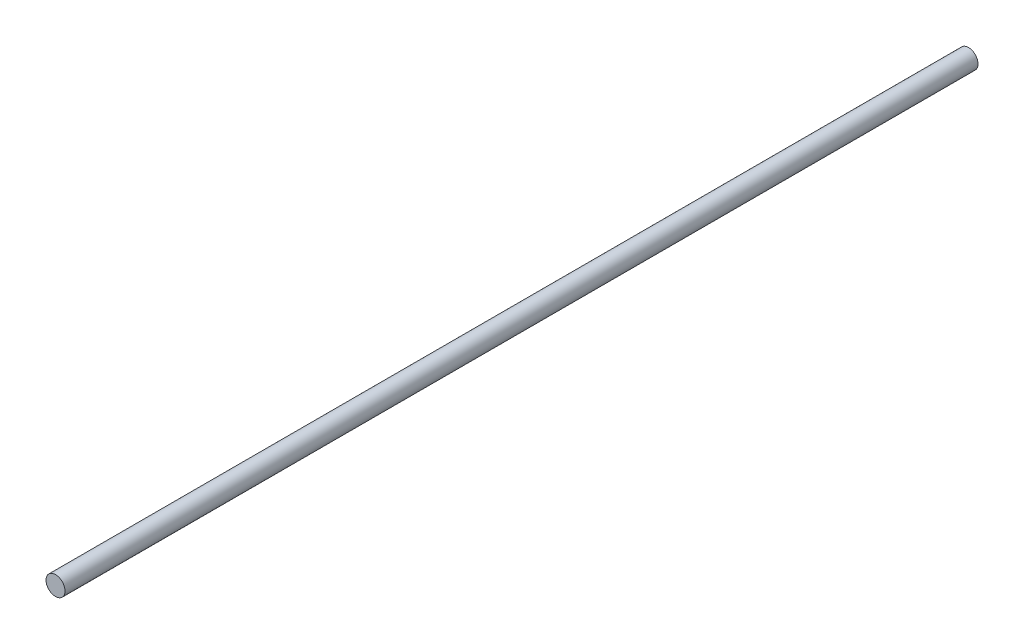
ISO-10303-21;
HEADER;
FILE_DESCRIPTION(('STEP AP214'),'2;1');
FILE_NAME('part.step','',(''),(''),'','','');
FILE_SCHEMA(('AUTOMOTIVE_DESIGN { 1 0 10303 214 1 1 1 1 }'));
ENDSEC;
DATA;
#1=APPLICATION_CONTEXT('core data for automotive mechanical design processes');
#2=APPLICATION_PROTOCOL_DEFINITION('international standard','automotive_design',2000,#1);
#3=PRODUCT_CONTEXT('',#1,'mechanical');
#4=PRODUCT('Part','Part','',(#3));
#5=PRODUCT_RELATED_PRODUCT_CATEGORY('part','',(#4));
#6=PRODUCT_DEFINITION_FORMATION('','',#4);
#7=PRODUCT_DEFINITION_CONTEXT('part definition',#1,'design');
#8=PRODUCT_DEFINITION('design','',#6,#7);
#9=PRODUCT_DEFINITION_SHAPE('','',#8);
#10=(LENGTH_UNIT() NAMED_UNIT(*) SI_UNIT(.MILLI.,.METRE.));
#11=(NAMED_UNIT(*) PLANE_ANGLE_UNIT() SI_UNIT($,.RADIAN.));
#12=(NAMED_UNIT(*) SI_UNIT($,.STERADIAN.) SOLID_ANGLE_UNIT());
#13=UNCERTAINTY_MEASURE_WITH_UNIT(LENGTH_MEASURE(1.E-05),#10,'distance_accuracy_value','');
#14=(GEOMETRIC_REPRESENTATION_CONTEXT(3) GLOBAL_UNCERTAINTY_ASSIGNED_CONTEXT((#13)) GLOBAL_UNIT_ASSIGNED_CONTEXT((#10,
#11,#12)) REPRESENTATION_CONTEXT('',''));
#15=CARTESIAN_POINT('',(0.,0.,0.));
#16=DIRECTION('',(0.,0.,1.));
#17=DIRECTION('',(1.,0.,0.));
#18=AXIS2_PLACEMENT_3D('',#15,#16,#17);
#19=CARTESIAN_POINT('',(0.,0.,304.8));
#20=DIRECTION('',(0.,0.,-1.));
#21=DIRECTION('',(-1.,0.,0.));
#22=AXIS2_PLACEMENT_3D('',#19,#20,#21);
#23=CYLINDRICAL_SURFACE('',#22,3.175);
#24=CARTESIAN_POINT('',(0.,0.,304.8));
#25=DIRECTION('',(0.,0.,1.));
#26=DIRECTION('',(1.,0.,0.));
#27=AXIS2_PLACEMENT_3D('',#24,#25,#26);
#28=CIRCLE('',#27,3.175);
#29=CARTESIAN_POINT('',(-3.175,0.,304.8));
#30=VERTEX_POINT('',#29);
#31=EDGE_CURVE('E10',#30,#30,#28,.T.);
#32=CARTESIAN_POINT('',(0.,0.,0.));
#33=DIRECTION('',(0.,0.,1.));
#34=DIRECTION('',(1.,0.,0.));
#35=AXIS2_PLACEMENT_3D('',#32,#33,#34);
#36=CIRCLE('',#35,3.175);
#37=CARTESIAN_POINT('',(-3.175,0.,0.));
#38=VERTEX_POINT('',#37);
#39=EDGE_CURVE('E34',#38,#38,#36,.T.);
#40=CARTESIAN_POINT('',(-3.175,0.,304.8));
#41=CARTESIAN_POINT('',(-3.175,0.,301.625));
#42=CARTESIAN_POINT('',(-3.175,0.,298.45));
#43=CARTESIAN_POINT('',(-3.175,0.,292.1));
#44=CARTESIAN_POINT('',(-3.175,0.,288.925));
#45=CARTESIAN_POINT('',(-3.175,0.,282.575));
#46=CARTESIAN_POINT('',(-3.175,0.,279.4));
#47=CARTESIAN_POINT('',(-3.175,0.,273.05));
#48=CARTESIAN_POINT('',(-3.175,0.,269.875));
#49=CARTESIAN_POINT('',(-3.175,0.,263.525));
#50=CARTESIAN_POINT('',(-3.175,0.,260.35));
#51=CARTESIAN_POINT('',(-3.175,0.,254.));
#52=CARTESIAN_POINT('',(-3.175,0.,250.825));
#53=CARTESIAN_POINT('',(-3.175,0.,244.475));
#54=CARTESIAN_POINT('',(-3.175,0.,241.3));
#55=CARTESIAN_POINT('',(-3.175,0.,234.95));
#56=CARTESIAN_POINT('',(-3.175,0.,231.775));
#57=CARTESIAN_POINT('',(-3.175,0.,225.425));
#58=CARTESIAN_POINT('',(-3.175,0.,222.25));
#59=CARTESIAN_POINT('',(-3.175,0.,215.9));
#60=CARTESIAN_POINT('',(-3.175,0.,212.725));
#61=CARTESIAN_POINT('',(-3.175,0.,206.375));
#62=CARTESIAN_POINT('',(-3.175,0.,203.2));
#63=CARTESIAN_POINT('',(-3.175,0.,196.85));
#64=CARTESIAN_POINT('',(-3.175,0.,193.675));
#65=CARTESIAN_POINT('',(-3.175,0.,187.325));
#66=CARTESIAN_POINT('',(-3.175,0.,184.15));
#67=CARTESIAN_POINT('',(-3.175,0.,177.8));
#68=CARTESIAN_POINT('',(-3.175,0.,174.625));
#69=CARTESIAN_POINT('',(-3.175,0.,168.275));
#70=CARTESIAN_POINT('',(-3.175,0.,165.1));
#71=CARTESIAN_POINT('',(-3.175,0.,158.75));
#72=CARTESIAN_POINT('',(-3.175,0.,155.575));
#73=CARTESIAN_POINT('',(-3.175,0.,149.225));
#74=CARTESIAN_POINT('',(-3.175,0.,146.05));
#75=CARTESIAN_POINT('',(-3.175,0.,139.7));
#76=CARTESIAN_POINT('',(-3.175,0.,136.525));
#77=CARTESIAN_POINT('',(-3.175,0.,130.175));
#78=CARTESIAN_POINT('',(-3.175,0.,127.));
#79=CARTESIAN_POINT('',(-3.175,0.,120.65));
#80=CARTESIAN_POINT('',(-3.175,0.,117.475));
#81=CARTESIAN_POINT('',(-3.175,0.,111.125));
#82=CARTESIAN_POINT('',(-3.175,0.,107.95));
#83=CARTESIAN_POINT('',(-3.175,0.,101.6));
#84=CARTESIAN_POINT('',(-3.175,0.,98.425));
#85=CARTESIAN_POINT('',(-3.175,0.,92.075));
#86=CARTESIAN_POINT('',(-3.175,0.,88.9));
#87=CARTESIAN_POINT('',(-3.175,0.,82.55));
#88=CARTESIAN_POINT('',(-3.175,0.,79.375));
#89=CARTESIAN_POINT('',(-3.175,0.,73.025));
#90=CARTESIAN_POINT('',(-3.175,0.,69.85));
#91=CARTESIAN_POINT('',(-3.175,0.,63.5));
#92=CARTESIAN_POINT('',(-3.175,0.,60.325));
#93=CARTESIAN_POINT('',(-3.175,0.,53.975));
#94=CARTESIAN_POINT('',(-3.175,0.,50.8));
#95=CARTESIAN_POINT('',(-3.175,0.,44.45));
#96=CARTESIAN_POINT('',(-3.175,0.,41.275));
#97=CARTESIAN_POINT('',(-3.175,0.,34.925));
#98=CARTESIAN_POINT('',(-3.175,0.,31.75));
#99=CARTESIAN_POINT('',(-3.175,0.,25.4));
#100=CARTESIAN_POINT('',(-3.175,0.,22.225));
#101=CARTESIAN_POINT('',(-3.175,0.,15.875));
#102=CARTESIAN_POINT('',(-3.175,0.,12.7));
#103=CARTESIAN_POINT('',(-3.175,0.,6.35));
#104=CARTESIAN_POINT('',(-3.175,0.,3.175));
#105=CARTESIAN_POINT('',(-3.175,0.,0.));
#106=B_SPLINE_CURVE_WITH_KNOTS('',3,(#40,#41,#42,#43,#44,#45,#46,#47,#48,#49,#50,#51,#52,#53,
#54,#55,#56,#57,#58,#59,#60,#61,#62,#63,#64,#65,#66,#67,#68,#69,#70,#71,#72,#73,#74,#75,#76,#77,
#78,#79,#80,#81,#82,#83,#84,#85,#86,#87,#88,#89,#90,#91,#92,#93,#94,#95,#96,#97,#98,#99,#100,
#101,#102,#103,#104,#105),.UNSPECIFIED.,.F.,.F.,(4,2,2,2,2,2,2,2,2,2,2,2,2,2,2,2,2,2,2,2,2,2,2,
2,2,2,2,2,2,2,2,2,4),(0.,9.52499999999995,19.05,28.575,38.1,47.625,57.15,66.675,76.2,85.725,
95.2499999999999,104.775,114.3,123.825,133.35,142.875,152.4,161.925,171.45,180.975,190.5,
200.025,209.55,219.075,228.6,238.125,247.65,257.175,266.7,276.225,285.75,295.275,304.8),.UNSPECIFIED.);
#107=EDGE_CURVE('BSEAM31',#30,#38,#106,.T.);
#108=ORIENTED_EDGE('',*,*,#31,.F.);
#109=ORIENTED_EDGE('',*,*,#39,.T.);
#110=ORIENTED_EDGE('',*,*,#107,.T.);
#111=ORIENTED_EDGE('',*,*,#107,.F.);
#112=EDGE_LOOP('',(#108,#110,#109,#111));
#113=FACE_BOUND('',#112,.T.);
#114=ADVANCED_FACE('F31',(#113),#23,.T.);
#115=CARTESIAN_POINT('',(0.,0.,304.8));
#116=DIRECTION('',(0.,0.,1.));
#117=DIRECTION('',(1.,0.,0.));
#118=AXIS2_PLACEMENT_3D('',#115,#116,#117);
#119=PLANE('',#118);
#120=ORIENTED_EDGE('',*,*,#31,.T.);
#121=EDGE_LOOP('',(#120));
#122=FACE_BOUND('',#121,.T.);
#123=ADVANCED_FACE('F46',(#122),#119,.T.);
#124=CARTESIAN_POINT('',(0.,0.,0.));
#125=DIRECTION('',(0.,0.,1.));
#126=DIRECTION('',(1.,0.,0.));
#127=AXIS2_PLACEMENT_3D('',#124,#125,#126);
#128=PLANE('',#127);
#129=ORIENTED_EDGE('',*,*,#39,.F.);
#130=EDGE_LOOP('',(#129));
#131=FACE_BOUND('',#130,.T.);
#132=ADVANCED_FACE('F44',(#131),#128,.F.);
#133=CLOSED_SHELL('',(#114,#123,#132));
#134=MANIFOLD_SOLID_BREP('B2',#133);
#135=ADVANCED_BREP_SHAPE_REPRESENTATION('',(#18,#134),#14);
#136=SHAPE_DEFINITION_REPRESENTATION(#9,#135);
ENDSEC;
END-ISO-10303-21;
